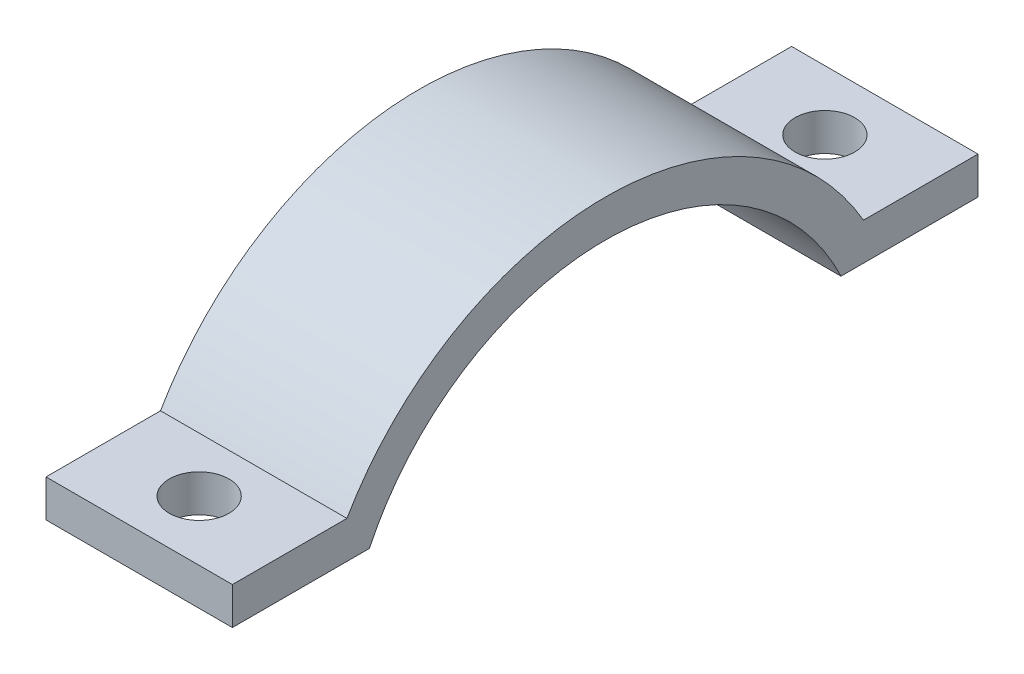
ISO-10303-21;
HEADER;
FILE_DESCRIPTION(('STEP AP214'),'2;1');
FILE_NAME('part.step','',(''),(''),'','','');
FILE_SCHEMA(('AUTOMOTIVE_DESIGN { 1 0 10303 214 1 1 1 1 }'));
ENDSEC;
DATA;
#1=APPLICATION_CONTEXT('core data for automotive mechanical design processes');
#2=APPLICATION_PROTOCOL_DEFINITION('international standard','automotive_design',2000,#1);
#3=PRODUCT_CONTEXT('',#1,'mechanical');
#4=PRODUCT('Part','Part','',(#3));
#5=PRODUCT_RELATED_PRODUCT_CATEGORY('part','',(#4));
#6=PRODUCT_DEFINITION_FORMATION('','',#4);
#7=PRODUCT_DEFINITION_CONTEXT('part definition',#1,'design');
#8=PRODUCT_DEFINITION('design','',#6,#7);
#9=PRODUCT_DEFINITION_SHAPE('','',#8);
#10=(LENGTH_UNIT() NAMED_UNIT(*) SI_UNIT(.MILLI.,.METRE.));
#11=(NAMED_UNIT(*) PLANE_ANGLE_UNIT() SI_UNIT($,.RADIAN.));
#12=(NAMED_UNIT(*) SI_UNIT($,.STERADIAN.) SOLID_ANGLE_UNIT());
#13=UNCERTAINTY_MEASURE_WITH_UNIT(LENGTH_MEASURE(1.E-05),#10,'distance_accuracy_value','');
#14=(GEOMETRIC_REPRESENTATION_CONTEXT(3) GLOBAL_UNCERTAINTY_ASSIGNED_CONTEXT((#13)) GLOBAL_UNIT_ASSIGNED_CONTEXT((#10,
#11,#12)) REPRESENTATION_CONTEXT('',''));
#15=CARTESIAN_POINT('',(0.,0.,0.));
#16=DIRECTION('',(0.,0.,1.));
#17=DIRECTION('',(1.,0.,0.));
#18=AXIS2_PLACEMENT_3D('',#15,#16,#17);
#19=CARTESIAN_POINT('',(10.,0.,0.));
#20=DIRECTION('',(-1.,0.,0.));
#21=DIRECTION('',(0.,0.,1.));
#22=AXIS2_PLACEMENT_3D('',#19,#20,#21);
#23=CYLINDRICAL_SURFACE('',#22,14.);
#24=CARTESIAN_POINT('',(0.,0.,0.));
#25=DIRECTION('',(-1.,0.,0.));
#26=DIRECTION('',(0.,0.,-1.));
#27=AXIS2_PLACEMENT_3D('',#24,#25,#26);
#28=CIRCLE('',#27,14.);
#29=CARTESIAN_POINT('',(0.,6.,12.6491106406735));
#30=VERTEX_POINT('',#29);
#31=CARTESIAN_POINT('',(0.,6.,-12.6491106406735));
#32=VERTEX_POINT('',#31);
#33=EDGE_CURVE('E131',#30,#32,#28,.T.);
#34=ORIENTED_EDGE('',*,*,#33,.T.);
#35=DIRECTION('',(-1.,0.,0.));
#36=VECTOR('',#35,1.);
#37=CARTESIAN_POINT('',(10.,6.,-12.6491106406735));
#38=LINE('',#37,#36);
#39=CARTESIAN_POINT('',(10.,6.,-12.6491106406735));
#40=VERTEX_POINT('',#39);
#41=EDGE_CURVE('E11',#40,#32,#38,.T.);
#42=ORIENTED_EDGE('',*,*,#41,.F.);
#43=CARTESIAN_POINT('',(10.,0.,0.));
#44=DIRECTION('',(-1.,0.,0.));
#45=DIRECTION('',(0.,0.,-1.));
#46=AXIS2_PLACEMENT_3D('',#43,#44,#45);
#47=CIRCLE('',#46,14.);
#48=CARTESIAN_POINT('',(10.,6.,12.6491106406735));
#49=VERTEX_POINT('',#48);
#50=EDGE_CURVE('E146',#49,#40,#47,.T.);
#51=ORIENTED_EDGE('',*,*,#50,.F.);
#52=DIRECTION('',(-1.,0.,0.));
#53=VECTOR('',#52,1.);
#54=CARTESIAN_POINT('',(10.,6.,12.6491106406735));
#55=LINE('',#54,#53);
#56=EDGE_CURVE('E127',#49,#30,#55,.T.);
#57=ORIENTED_EDGE('',*,*,#56,.T.);
#58=EDGE_LOOP('',(#34,#42,#51,#57));
#59=FACE_BOUND('',#58,.T.);
#60=ADVANCED_FACE('F34',(#59),#23,.F.);
#61=CARTESIAN_POINT('',(10.,6.,-12.6491106406735));
#62=DIRECTION('',(0.,1.,0.));
#63=DIRECTION('',(0.,0.,1.));
#64=AXIS2_PLACEMENT_3D('',#61,#62,#63);
#65=PLANE('',#64);
#66=CARTESIAN_POINT('',(5.,6.,-16.785));
#67=DIRECTION('',(0.,1.,0.));
#68=DIRECTION('',(0.,0.,1.));
#69=AXIS2_PLACEMENT_3D('',#66,#67,#68);
#70=CIRCLE('',#69,1.6);
#71=CARTESIAN_POINT('',(5.,6.,-15.185));
#72=VERTEX_POINT('',#71);
#73=EDGE_CURVE('E135',#72,#72,#70,.T.);
#74=ORIENTED_EDGE('',*,*,#73,.T.);
#75=EDGE_LOOP('',(#74));
#76=FACE_BOUND('',#75,.T.);
#77=DIRECTION('',(0.,0.,-1.));
#78=VECTOR('',#77,1.);
#79=CARTESIAN_POINT('',(0.,6.,-12.6491106406735));
#80=LINE('',#79,#78);
#81=CARTESIAN_POINT('',(0.,6.,-20.));
#82=VERTEX_POINT('',#81);
#83=EDGE_CURVE('E134',#32,#82,#80,.T.);
#84=ORIENTED_EDGE('',*,*,#83,.T.);
#85=DIRECTION('',(-1.,0.,0.));
#86=VECTOR('',#85,1.);
#87=CARTESIAN_POINT('',(10.,6.,-20.));
#88=LINE('',#87,#86);
#89=CARTESIAN_POINT('',(10.,6.,-20.));
#90=VERTEX_POINT('',#89);
#91=EDGE_CURVE('E43',#90,#82,#88,.T.);
#92=ORIENTED_EDGE('',*,*,#91,.F.);
#93=DIRECTION('',(0.,0.,-1.));
#94=VECTOR('',#93,1.);
#95=CARTESIAN_POINT('',(10.,6.,-12.6491106406735));
#96=LINE('',#95,#94);
#97=EDGE_CURVE('E94',#40,#90,#96,.T.);
#98=ORIENTED_EDGE('',*,*,#97,.F.);
#99=ORIENTED_EDGE('',*,*,#41,.T.);
#100=EDGE_LOOP('',(#84,#92,#98,#99));
#101=FACE_BOUND('',#100,.T.);
#102=ADVANCED_FACE('F207',(#76,#101),#65,.F.);
#103=CARTESIAN_POINT('',(10.,6.,-20.));
#104=DIRECTION('',(0.,0.,1.));
#105=DIRECTION('',(1.,0.,0.));
#106=AXIS2_PLACEMENT_3D('',#103,#104,#105);
#107=PLANE('',#106);
#108=DIRECTION('',(0.,1.,0.));
#109=VECTOR('',#108,1.);
#110=CARTESIAN_POINT('',(0.,6.,-20.));
#111=LINE('',#110,#109);
#112=CARTESIAN_POINT('',(0.,8.,-20.));
#113=VERTEX_POINT('',#112);
#114=EDGE_CURVE('E137',#82,#113,#111,.T.);
#115=ORIENTED_EDGE('',*,*,#114,.T.);
#116=DIRECTION('',(-1.,0.,0.));
#117=VECTOR('',#116,1.);
#118=CARTESIAN_POINT('',(10.,8.,-20.));
#119=LINE('',#118,#117);
#120=CARTESIAN_POINT('',(10.,8.,-20.));
#121=VERTEX_POINT('',#120);
#122=EDGE_CURVE('E153',#121,#113,#119,.T.);
#123=ORIENTED_EDGE('',*,*,#122,.F.);
#124=DIRECTION('',(0.,1.,0.));
#125=VECTOR('',#124,1.);
#126=CARTESIAN_POINT('',(10.,6.,-20.));
#127=LINE('',#126,#125);
#128=EDGE_CURVE('E162',#90,#121,#127,.T.);
#129=ORIENTED_EDGE('',*,*,#128,.F.);
#130=ORIENTED_EDGE('',*,*,#91,.T.);
#131=EDGE_LOOP('',(#115,#123,#129,#130));
#132=FACE_BOUND('',#131,.T.);
#133=ADVANCED_FACE('F160',(#132),#107,.F.);
#134=CARTESIAN_POINT('',(10.,8.,-20.));
#135=DIRECTION('',(0.,-1.,0.));
#136=DIRECTION('',(0.,0.,-1.));
#137=AXIS2_PLACEMENT_3D('',#134,#135,#136);
#138=PLANE('',#137);
#139=CARTESIAN_POINT('',(5.,8.00000000000001,-16.785));
#140=DIRECTION('',(0.,1.,0.));
#141=DIRECTION('',(0.,0.,1.));
#142=AXIS2_PLACEMENT_3D('',#139,#140,#141);
#143=CIRCLE('',#142,1.6);
#144=CARTESIAN_POINT('',(5.,8.00000000000001,-15.185));
#145=VERTEX_POINT('',#144);
#146=EDGE_CURVE('E185',#145,#145,#143,.T.);
#147=ORIENTED_EDGE('',*,*,#146,.F.);
#148=EDGE_LOOP('',(#147));
#149=FACE_BOUND('',#148,.T.);
#150=DIRECTION('',(0.,0.,1.));
#151=VECTOR('',#150,1.);
#152=CARTESIAN_POINT('',(0.,8.,-20.));
#153=LINE('',#152,#151);
#154=CARTESIAN_POINT('',(0.,8.,-13.856406460551));
#155=VERTEX_POINT('',#154);
#156=EDGE_CURVE('E139',#113,#155,#153,.T.);
#157=ORIENTED_EDGE('',*,*,#156,.T.);
#158=DIRECTION('',(-1.,0.,0.));
#159=VECTOR('',#158,1.);
#160=CARTESIAN_POINT('',(10.,8.,-13.856406460551));
#161=LINE('',#160,#159);
#162=CARTESIAN_POINT('',(10.,8.,-13.856406460551));
#163=VERTEX_POINT('',#162);
#164=EDGE_CURVE('E150',#163,#155,#161,.T.);
#165=ORIENTED_EDGE('',*,*,#164,.F.);
#166=DIRECTION('',(0.,0.,1.));
#167=VECTOR('',#166,1.);
#168=CARTESIAN_POINT('',(10.,8.,-20.));
#169=LINE('',#168,#167);
#170=EDGE_CURVE('E174',#121,#163,#169,.T.);
#171=ORIENTED_EDGE('',*,*,#170,.F.);
#172=ORIENTED_EDGE('',*,*,#122,.T.);
#173=EDGE_LOOP('',(#157,#165,#171,#172));
#174=FACE_BOUND('',#173,.T.);
#175=ADVANCED_FACE('F170',(#149,#174),#138,.F.);
#176=CARTESIAN_POINT('',(10.,0.,0.));
#177=DIRECTION('',(-1.,0.,0.));
#178=DIRECTION('',(0.,0.,1.));
#179=AXIS2_PLACEMENT_3D('',#176,#177,#178);
#180=CYLINDRICAL_SURFACE('',#179,16.);
#181=CARTESIAN_POINT('',(0.,0.,0.));
#182=DIRECTION('',(1.,0.,0.));
#183=DIRECTION('',(0.,0.,-1.));
#184=AXIS2_PLACEMENT_3D('',#181,#182,#183);
#185=CIRCLE('',#184,16.);
#186=CARTESIAN_POINT('',(0.,8.,13.856406460551));
#187=VERTEX_POINT('',#186);
#188=EDGE_CURVE('E141',#155,#187,#185,.T.);
#189=ORIENTED_EDGE('',*,*,#188,.T.);
#190=DIRECTION('',(-1.,0.,0.));
#191=VECTOR('',#190,1.);
#192=CARTESIAN_POINT('',(10.,8.,13.856406460551));
#193=LINE('',#192,#191);
#194=CARTESIAN_POINT('',(10.,8.,13.856406460551));
#195=VERTEX_POINT('',#194);
#196=EDGE_CURVE('E122',#195,#187,#193,.T.);
#197=ORIENTED_EDGE('',*,*,#196,.F.);
#198=CARTESIAN_POINT('',(10.,0.,0.));
#199=DIRECTION('',(1.,0.,0.));
#200=DIRECTION('',(0.,0.,-1.));
#201=AXIS2_PLACEMENT_3D('',#198,#199,#200);
#202=CIRCLE('',#201,16.);
#203=EDGE_CURVE('E113',#163,#195,#202,.T.);
#204=ORIENTED_EDGE('',*,*,#203,.F.);
#205=ORIENTED_EDGE('',*,*,#164,.T.);
#206=EDGE_LOOP('',(#189,#197,#204,#205));
#207=FACE_BOUND('',#206,.T.);
#208=ADVANCED_FACE('F173',(#207),#180,.T.);
#209=CARTESIAN_POINT('',(10.,8.,20.));
#210=DIRECTION('',(0.,-1.,0.));
#211=DIRECTION('',(0.,0.,-1.));
#212=AXIS2_PLACEMENT_3D('',#209,#210,#211);
#213=PLANE('',#212);
#214=CARTESIAN_POINT('',(5.,8.,16.785));
#215=DIRECTION('',(0.,1.,0.));
#216=DIRECTION('',(0.,0.,1.));
#217=AXIS2_PLACEMENT_3D('',#214,#215,#216);
#218=CIRCLE('',#217,1.6);
#219=CARTESIAN_POINT('',(5.,8.,18.385));
#220=VERTEX_POINT('',#219);
#221=EDGE_CURVE('E182',#220,#220,#218,.T.);
#222=ORIENTED_EDGE('',*,*,#221,.F.);
#223=EDGE_LOOP('',(#222));
#224=FACE_BOUND('',#223,.T.);
#225=DIRECTION('',(0.,0.,1.));
#226=VECTOR('',#225,1.);
#227=CARTESIAN_POINT('',(0.,8.,20.));
#228=LINE('',#227,#226);
#229=CARTESIAN_POINT('',(0.,8.,20.));
#230=VERTEX_POINT('',#229);
#231=EDGE_CURVE('E121',#187,#230,#228,.T.);
#232=ORIENTED_EDGE('',*,*,#231,.T.);
#233=DIRECTION('',(-1.,0.,0.));
#234=VECTOR('',#233,1.);
#235=CARTESIAN_POINT('',(10.,8.,20.));
#236=LINE('',#235,#234);
#237=CARTESIAN_POINT('',(10.,8.,20.));
#238=VERTEX_POINT('',#237);
#239=EDGE_CURVE('E118',#238,#230,#236,.T.);
#240=ORIENTED_EDGE('',*,*,#239,.F.);
#241=DIRECTION('',(0.,0.,1.));
#242=VECTOR('',#241,1.);
#243=CARTESIAN_POINT('',(10.,8.,20.));
#244=LINE('',#243,#242);
#245=EDGE_CURVE('E107',#195,#238,#244,.T.);
#246=ORIENTED_EDGE('',*,*,#245,.F.);
#247=ORIENTED_EDGE('',*,*,#196,.T.);
#248=EDGE_LOOP('',(#232,#240,#246,#247));
#249=FACE_BOUND('',#248,.T.);
#250=ADVANCED_FACE('F119',(#224,#249),#213,.F.);
#251=CARTESIAN_POINT('',(10.,6.,20.));
#252=DIRECTION('',(0.,0.,-1.));
#253=DIRECTION('',(-1.,0.,0.));
#254=AXIS2_PLACEMENT_3D('',#251,#252,#253);
#255=PLANE('',#254);
#256=DIRECTION('',(0.,-1.,0.));
#257=VECTOR('',#256,1.);
#258=CARTESIAN_POINT('',(0.,6.,20.));
#259=LINE('',#258,#257);
#260=CARTESIAN_POINT('',(0.,6.,20.));
#261=VERTEX_POINT('',#260);
#262=EDGE_CURVE('E80',#230,#261,#259,.T.);
#263=ORIENTED_EDGE('',*,*,#262,.T.);
#264=DIRECTION('',(-1.,0.,0.));
#265=VECTOR('',#264,1.);
#266=CARTESIAN_POINT('',(10.,6.,20.));
#267=LINE('',#266,#265);
#268=CARTESIAN_POINT('',(10.,6.,20.));
#269=VERTEX_POINT('',#268);
#270=EDGE_CURVE('E123',#269,#261,#267,.T.);
#271=ORIENTED_EDGE('',*,*,#270,.F.);
#272=DIRECTION('',(0.,-1.,0.));
#273=VECTOR('',#272,1.);
#274=CARTESIAN_POINT('',(10.,6.,20.));
#275=LINE('',#274,#273);
#276=EDGE_CURVE('E111',#238,#269,#275,.T.);
#277=ORIENTED_EDGE('',*,*,#276,.F.);
#278=ORIENTED_EDGE('',*,*,#239,.T.);
#279=EDGE_LOOP('',(#263,#271,#277,#278));
#280=FACE_BOUND('',#279,.T.);
#281=ADVANCED_FACE('F125',(#280),#255,.F.);
#282=CARTESIAN_POINT('',(10.,6.,12.6491106406735));
#283=DIRECTION('',(0.,1.,0.));
#284=DIRECTION('',(0.,0.,1.));
#285=AXIS2_PLACEMENT_3D('',#282,#283,#284);
#286=PLANE('',#285);
#287=CARTESIAN_POINT('',(5.,6.,16.785));
#288=DIRECTION('',(0.,1.,0.));
#289=DIRECTION('',(0.,0.,1.));
#290=AXIS2_PLACEMENT_3D('',#287,#288,#289);
#291=CIRCLE('',#290,1.6);
#292=CARTESIAN_POINT('',(5.,6.,18.385));
#293=VERTEX_POINT('',#292);
#294=EDGE_CURVE('E37',#293,#293,#291,.T.);
#295=ORIENTED_EDGE('',*,*,#294,.T.);
#296=EDGE_LOOP('',(#295));
#297=FACE_BOUND('',#296,.T.);
#298=DIRECTION('',(0.,0.,-1.));
#299=VECTOR('',#298,1.);
#300=CARTESIAN_POINT('',(0.,6.,12.6491106406735));
#301=LINE('',#300,#299);
#302=EDGE_CURVE('E86',#261,#30,#301,.T.);
#303=ORIENTED_EDGE('',*,*,#302,.T.);
#304=ORIENTED_EDGE('',*,*,#56,.F.);
#305=DIRECTION('',(0.,0.,-1.));
#306=VECTOR('',#305,1.);
#307=CARTESIAN_POINT('',(10.,6.,12.6491106406735));
#308=LINE('',#307,#306);
#309=EDGE_CURVE('E51',#269,#49,#308,.T.);
#310=ORIENTED_EDGE('',*,*,#309,.F.);
#311=ORIENTED_EDGE('',*,*,#270,.T.);
#312=EDGE_LOOP('',(#303,#304,#310,#311));
#313=FACE_BOUND('',#312,.T.);
#314=ADVANCED_FACE('F192',(#297,#313),#286,.F.);
#315=CARTESIAN_POINT('',(10.,0.,0.));
#316=DIRECTION('',(1.,0.,0.));
#317=DIRECTION('',(0.,0.,-1.));
#318=AXIS2_PLACEMENT_3D('',#315,#316,#317);
#319=PLANE('',#318);
#320=ORIENTED_EDGE('',*,*,#50,.T.);
#321=ORIENTED_EDGE('',*,*,#97,.T.);
#322=ORIENTED_EDGE('',*,*,#128,.T.);
#323=ORIENTED_EDGE('',*,*,#170,.T.);
#324=ORIENTED_EDGE('',*,*,#203,.T.);
#325=ORIENTED_EDGE('',*,*,#245,.T.);
#326=ORIENTED_EDGE('',*,*,#276,.T.);
#327=ORIENTED_EDGE('',*,*,#309,.T.);
#328=EDGE_LOOP('',(#320,#321,#322,#323,#324,#325,#326,#327));
#329=FACE_BOUND('',#328,.T.);
#330=ADVANCED_FACE('F109',(#329),#319,.T.);
#331=CARTESIAN_POINT('',(0.,0.,0.));
#332=DIRECTION('',(1.,0.,0.));
#333=DIRECTION('',(0.,0.,-1.));
#334=AXIS2_PLACEMENT_3D('',#331,#332,#333);
#335=PLANE('',#334);
#336=ORIENTED_EDGE('',*,*,#33,.F.);
#337=ORIENTED_EDGE('',*,*,#302,.F.);
#338=ORIENTED_EDGE('',*,*,#262,.F.);
#339=ORIENTED_EDGE('',*,*,#231,.F.);
#340=ORIENTED_EDGE('',*,*,#188,.F.);
#341=ORIENTED_EDGE('',*,*,#156,.F.);
#342=ORIENTED_EDGE('',*,*,#114,.F.);
#343=ORIENTED_EDGE('',*,*,#83,.F.);
#344=EDGE_LOOP('',(#336,#337,#338,#339,#340,#341,#342,#343));
#345=FACE_BOUND('',#344,.T.);
#346=ADVANCED_FACE('F166',(#345),#335,.F.);
#347=CARTESIAN_POINT('',(5.,-2.,16.785));
#348=DIRECTION('',(0.,1.,0.));
#349=DIRECTION('',(0.,0.,1.));
#350=AXIS2_PLACEMENT_3D('',#347,#348,#349);
#351=CYLINDRICAL_SURFACE('',#350,1.6);
#352=ORIENTED_EDGE('',*,*,#221,.T.);
#353=EDGE_LOOP('',(#352));
#354=FACE_BOUND('',#353,.T.);
#355=ORIENTED_EDGE('',*,*,#294,.F.);
#356=EDGE_LOOP('',(#355));
#357=FACE_BOUND('',#356,.T.);
#358=ADVANCED_FACE('F194',(#354,#357),#351,.F.);
#359=CARTESIAN_POINT('',(5.,-1.99999999999999,-16.785));
#360=DIRECTION('',(0.,1.,0.));
#361=DIRECTION('',(0.,0.,1.));
#362=AXIS2_PLACEMENT_3D('',#359,#360,#361);
#363=CYLINDRICAL_SURFACE('',#362,1.6);
#364=ORIENTED_EDGE('',*,*,#146,.T.);
#365=EDGE_LOOP('',(#364));
#366=FACE_BOUND('',#365,.T.);
#367=ORIENTED_EDGE('',*,*,#73,.F.);
#368=EDGE_LOOP('',(#367));
#369=FACE_BOUND('',#368,.T.);
#370=ADVANCED_FACE('F196',(#366,#369),#363,.F.);
#371=CLOSED_SHELL('',(#60,#102,#133,#175,#208,#250,#281,#314,#330,#346,#358,#370));
#372=MANIFOLD_SOLID_BREP('B2',#371);
#373=ADVANCED_BREP_SHAPE_REPRESENTATION('',(#18,#372),#14);
#374=SHAPE_DEFINITION_REPRESENTATION(#9,#373);
ENDSEC;
END-ISO-10303-21;
